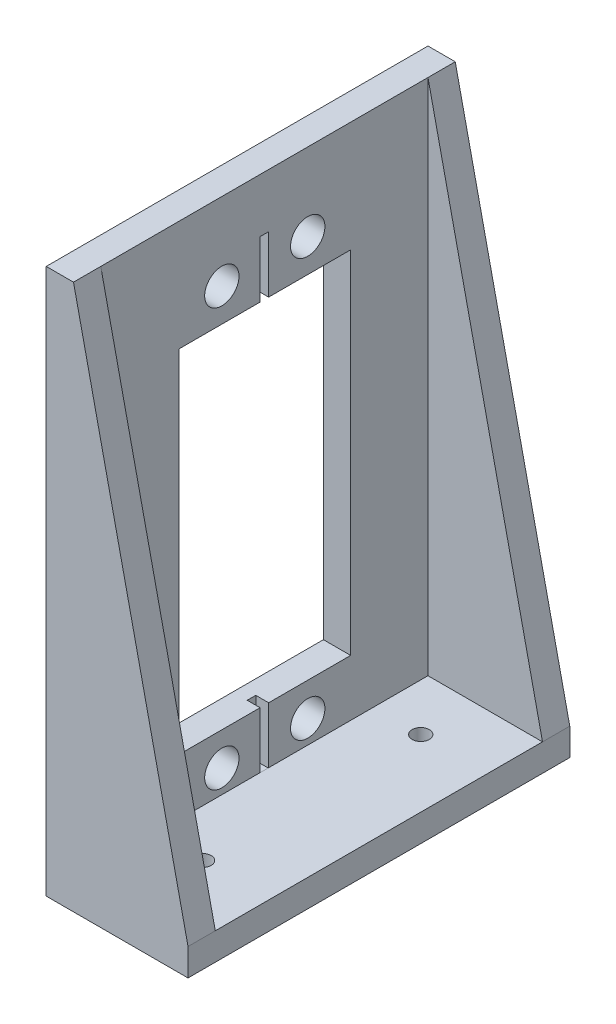
ISO-10303-21;
HEADER;
FILE_DESCRIPTION(('STEP AP214'),'2;1');
FILE_NAME('part.step','',(''),(''),'','','');
FILE_SCHEMA(('AUTOMOTIVE_DESIGN { 1 0 10303 214 1 1 1 1 }'));
ENDSEC;
DATA;
#1=APPLICATION_CONTEXT('core data for automotive mechanical design processes');
#2=APPLICATION_PROTOCOL_DEFINITION('international standard','automotive_design',2000,#1);
#3=PRODUCT_CONTEXT('',#1,'mechanical');
#4=PRODUCT('Part','Part','',(#3));
#5=PRODUCT_RELATED_PRODUCT_CATEGORY('part','',(#4));
#6=PRODUCT_DEFINITION_FORMATION('','',#4);
#7=PRODUCT_DEFINITION_CONTEXT('part definition',#1,'design');
#8=PRODUCT_DEFINITION('design','',#6,#7);
#9=PRODUCT_DEFINITION_SHAPE('','',#8);
#10=(LENGTH_UNIT() NAMED_UNIT(*) SI_UNIT(.MILLI.,.METRE.));
#11=(NAMED_UNIT(*) PLANE_ANGLE_UNIT() SI_UNIT($,.RADIAN.));
#12=(NAMED_UNIT(*) SI_UNIT($,.STERADIAN.) SOLID_ANGLE_UNIT());
#13=UNCERTAINTY_MEASURE_WITH_UNIT(LENGTH_MEASURE(1.E-05),#10,'distance_accuracy_value','');
#14=(GEOMETRIC_REPRESENTATION_CONTEXT(3) GLOBAL_UNCERTAINTY_ASSIGNED_CONTEXT((#13)) GLOBAL_UNIT_ASSIGNED_CONTEXT((#10,
#11,#12)) REPRESENTATION_CONTEXT('',''));
#15=CARTESIAN_POINT('',(0.,0.,0.));
#16=DIRECTION('',(0.,0.,1.));
#17=DIRECTION('',(1.,0.,0.));
#18=AXIS2_PLACEMENT_3D('',#15,#16,#17);
#19=CARTESIAN_POINT('',(3.175,3.175,22.225));
#20=DIRECTION('',(0.,-1.,0.));
#21=DIRECTION('',(1.,0.,0.));
#22=AXIS2_PLACEMENT_3D('',#19,#20,#21);
#23=PLANE('',#22);
#24=CARTESIAN_POINT('',(8.67999991199999,3.175,-12.7));
#25=DIRECTION('',(0.,1.,0.));
#26=DIRECTION('',(-1.,0.,0.));
#27=AXIS2_PLACEMENT_3D('',#24,#25,#26);
#28=CIRCLE('',#27,1.000000032);
#29=CARTESIAN_POINT('',(7.67999987999999,3.175,-12.7));
#30=VERTEX_POINT('',#29);
#31=EDGE_CURVE('E367',#30,#30,#28,.T.);
#32=ORIENTED_EDGE('',*,*,#31,.F.);
#33=EDGE_LOOP('',(#32));
#34=FACE_BOUND('',#33,.T.);
#35=CARTESIAN_POINT('',(8.67999991199999,3.175,12.7));
#36=DIRECTION('',(0.,1.,0.));
#37=DIRECTION('',(1.,0.,0.));
#38=AXIS2_PLACEMENT_3D('',#35,#36,#37);
#39=CIRCLE('',#38,1.000000032);
#40=CARTESIAN_POINT('',(9.679999944,3.175,12.7));
#41=VERTEX_POINT('',#40);
#42=EDGE_CURVE('E371',#41,#41,#39,.T.);
#43=ORIENTED_EDGE('',*,*,#42,.F.);
#44=EDGE_LOOP('',(#43));
#45=FACE_BOUND('',#44,.T.);
#46=DIRECTION('',(1.,0.,0.));
#47=VECTOR('',#46,1.);
#48=CARTESIAN_POINT('',(16.51,3.175,-19.05));
#49=LINE('',#48,#47);
#50=CARTESIAN_POINT('',(3.175,3.175,-19.05));
#51=VERTEX_POINT('',#50);
#52=CARTESIAN_POINT('',(16.51,3.175,-19.05));
#53=VERTEX_POINT('',#52);
#54=EDGE_CURVE('E386',#51,#53,#49,.T.);
#55=ORIENTED_EDGE('',*,*,#54,.F.);
#56=DIRECTION('',(0.,0.,-1.));
#57=VECTOR('',#56,1.);
#58=CARTESIAN_POINT('',(3.175,3.175,22.225));
#59=LINE('',#58,#57);
#60=CARTESIAN_POINT('',(3.175,3.175,-0.500000016));
#61=VERTEX_POINT('',#60);
#62=EDGE_CURVE('E456',#61,#51,#59,.T.);
#63=ORIENTED_EDGE('',*,*,#62,.F.);
#64=DIRECTION('',(0.,0.,1.));
#65=VECTOR('',#64,1.);
#66=CARTESIAN_POINT('',(3.175,3.175,22.225));
#67=LINE('',#66,#65);
#68=CARTESIAN_POINT('',(3.175,3.175,0.500000016));
#69=VERTEX_POINT('',#68);
#70=EDGE_CURVE('E235',#61,#69,#67,.T.);
#71=ORIENTED_EDGE('',*,*,#70,.T.);
#72=CARTESIAN_POINT('',(3.175,3.175,19.05));
#73=VERTEX_POINT('',#72);
#74=EDGE_CURVE('E457',#73,#69,#59,.T.);
#75=ORIENTED_EDGE('',*,*,#74,.F.);
#76=DIRECTION('',(1.,0.,0.));
#77=VECTOR('',#76,1.);
#78=CARTESIAN_POINT('',(16.51,3.175,19.05));
#79=LINE('',#78,#77);
#80=CARTESIAN_POINT('',(16.51,3.175,19.05));
#81=VERTEX_POINT('',#80);
#82=EDGE_CURVE('E405',#73,#81,#79,.T.);
#83=ORIENTED_EDGE('',*,*,#82,.T.);
#84=DIRECTION('',(0.,0.,-1.));
#85=VECTOR('',#84,1.);
#86=CARTESIAN_POINT('',(16.51,3.175,22.225));
#87=LINE('',#86,#85);
#88=EDGE_CURVE('E460',#81,#53,#87,.T.);
#89=ORIENTED_EDGE('',*,*,#88,.T.);
#90=EDGE_LOOP('',(#55,#63,#71,#75,#83,#89));
#91=FACE_BOUND('',#90,.T.);
#92=ADVANCED_FACE('F43',(#34,#45,#91),#23,.F.);
#93=CARTESIAN_POINT('',(3.175,63.5,22.225));
#94=DIRECTION('',(-1.,0.,0.));
#95=DIRECTION('',(0.,-1.,0.));
#96=AXIS2_PLACEMENT_3D('',#93,#94,#95);
#97=PLANE('',#96);
#98=ORIENTED_EDGE('',*,*,#74,.T.);
#99=DIRECTION('',(0.,1.,0.));
#100=VECTOR('',#99,1.);
#101=CARTESIAN_POINT('',(3.175,3.120999981,0.500000016));
#102=LINE('',#101,#100);
#103=CARTESIAN_POINT('',(3.175,9.724999981,0.500000016));
#104=VERTEX_POINT('',#103);
#105=EDGE_CURVE('E197',#69,#104,#102,.T.);
#106=ORIENTED_EDGE('',*,*,#105,.T.);
#107=DIRECTION('',(0.,0.,-1.));
#108=VECTOR('',#107,1.);
#109=CARTESIAN_POINT('',(3.175,9.724999981,9.95299990599999));
#110=LINE('',#109,#108);
#111=CARTESIAN_POINT('',(3.175,9.724999981,9.95299990599999));
#112=VERTEX_POINT('',#111);
#113=EDGE_CURVE('E303',#112,#104,#110,.T.);
#114=ORIENTED_EDGE('',*,*,#113,.F.);
#115=DIRECTION('',(0.,-1.,0.));
#116=VECTOR('',#115,1.);
#117=CARTESIAN_POINT('',(3.175,50.624999969,9.952999906));
#118=LINE('',#117,#116);
#119=CARTESIAN_POINT('',(3.175,50.624999969,9.952999906));
#120=VERTEX_POINT('',#119);
#121=EDGE_CURVE('E273',#120,#112,#118,.T.);
#122=ORIENTED_EDGE('',*,*,#121,.F.);
#123=DIRECTION('',(0.,0.,1.));
#124=VECTOR('',#123,1.);
#125=CARTESIAN_POINT('',(3.175,50.624999969,9.952999906));
#126=LINE('',#125,#124);
#127=CARTESIAN_POINT('',(3.175,50.624999969,0.500000016));
#128=VERTEX_POINT('',#127);
#129=EDGE_CURVE('E311',#128,#120,#126,.T.);
#130=ORIENTED_EDGE('',*,*,#129,.F.);
#131=DIRECTION('',(0.,-1.,0.));
#132=VECTOR('',#131,1.);
#133=CARTESIAN_POINT('',(3.175,57.228999969,0.500000016));
#134=LINE('',#133,#132);
#135=CARTESIAN_POINT('',(3.175,57.228999969,0.500000016));
#136=VERTEX_POINT('',#135);
#137=EDGE_CURVE('E67',#136,#128,#134,.T.);
#138=ORIENTED_EDGE('',*,*,#137,.F.);
#139=DIRECTION('',(0.,0.,1.));
#140=VECTOR('',#139,1.);
#141=CARTESIAN_POINT('',(3.175,57.228999969,-0.500000016));
#142=LINE('',#141,#140);
#143=CARTESIAN_POINT('',(3.175,57.228999969,-0.500000016));
#144=VERTEX_POINT('',#143);
#145=EDGE_CURVE('E244',#144,#136,#142,.T.);
#146=ORIENTED_EDGE('',*,*,#145,.F.);
#147=DIRECTION('',(0.,-1.,0.));
#148=VECTOR('',#147,1.);
#149=CARTESIAN_POINT('',(3.175,57.228999969,-0.500000016));
#150=LINE('',#149,#148);
#151=CARTESIAN_POINT('',(3.175,50.624999969,-0.500000016));
#152=VERTEX_POINT('',#151);
#153=EDGE_CURVE('E269',#144,#152,#150,.T.);
#154=ORIENTED_EDGE('',*,*,#153,.T.);
#155=CARTESIAN_POINT('',(3.175,50.624999969,-10.046999972));
#156=VERTEX_POINT('',#155);
#157=EDGE_CURVE('E287',#156,#152,#126,.T.);
#158=ORIENTED_EDGE('',*,*,#157,.F.);
#159=DIRECTION('',(0.,1.,0.));
#160=VECTOR('',#159,1.);
#161=CARTESIAN_POINT('',(3.175,50.624999969,-10.046999972));
#162=LINE('',#161,#160);
#163=CARTESIAN_POINT('',(3.175,9.724999981,-10.046999972));
#164=VERTEX_POINT('',#163);
#165=EDGE_CURVE('E307',#164,#156,#162,.T.);
#166=ORIENTED_EDGE('',*,*,#165,.F.);
#167=CARTESIAN_POINT('',(3.175,9.724999981,-0.500000015999997));
#168=VERTEX_POINT('',#167);
#169=EDGE_CURVE('E302',#168,#164,#110,.T.);
#170=ORIENTED_EDGE('',*,*,#169,.F.);
#171=DIRECTION('',(0.,1.,0.));
#172=VECTOR('',#171,1.);
#173=CARTESIAN_POINT('',(3.175,3.120999981,-0.500000016));
#174=LINE('',#173,#172);
#175=EDGE_CURVE('E59',#61,#168,#174,.T.);
#176=ORIENTED_EDGE('',*,*,#175,.F.);
#177=ORIENTED_EDGE('',*,*,#62,.T.);
#178=DIRECTION('',(0.,-1.,0.));
#179=VECTOR('',#178,1.);
#180=CARTESIAN_POINT('',(3.175,3.175,-19.05));
#181=LINE('',#180,#179);
#182=CARTESIAN_POINT('',(3.175,63.5,-19.05));
#183=VERTEX_POINT('',#182);
#184=EDGE_CURVE('E378',#183,#51,#181,.T.);
#185=ORIENTED_EDGE('',*,*,#184,.F.);
#186=DIRECTION('',(0.,0.,-1.));
#187=VECTOR('',#186,1.);
#188=CARTESIAN_POINT('',(3.175,63.5,22.225));
#189=LINE('',#188,#187);
#190=CARTESIAN_POINT('',(3.175,63.5,19.05));
#191=VERTEX_POINT('',#190);
#192=EDGE_CURVE('E451',#191,#183,#189,.T.);
#193=ORIENTED_EDGE('',*,*,#192,.F.);
#194=DIRECTION('',(0.,-1.,0.));
#195=VECTOR('',#194,1.);
#196=CARTESIAN_POINT('',(3.175,3.175,19.05));
#197=LINE('',#196,#195);
#198=EDGE_CURVE('E401',#191,#73,#197,.T.);
#199=ORIENTED_EDGE('',*,*,#198,.T.);
#200=EDGE_LOOP('',(#98,#106,#114,#122,#130,#138,#146,#154,#158,#166,#170,#176,#177,#185,#193,#199));
#201=FACE_BOUND('',#200,.T.);
#202=CARTESIAN_POINT('',(3.175,5.874999934,-5.047000066));
#203=DIRECTION('',(1.,0.,0.));
#204=DIRECTION('',(0.,1.,0.));
#205=AXIS2_PLACEMENT_3D('',#202,#203,#204);
#206=CIRCLE('',#205,2.000000064);
#207=CARTESIAN_POINT('',(3.175,7.874999998,-5.047000066));
#208=VERTEX_POINT('',#207);
#209=EDGE_CURVE('E338',#208,#208,#206,.T.);
#210=ORIENTED_EDGE('',*,*,#209,.F.);
#211=EDGE_LOOP('',(#210));
#212=FACE_BOUND('',#211,.T.);
#213=CARTESIAN_POINT('',(3.175,54.475000016,4.953));
#214=DIRECTION('',(1.,0.,0.));
#215=DIRECTION('',(0.,1.,0.));
#216=AXIS2_PLACEMENT_3D('',#213,#214,#215);
#217=CIRCLE('',#216,2.000000064);
#218=CARTESIAN_POINT('',(3.175,56.47500008,4.953));
#219=VERTEX_POINT('',#218);
#220=EDGE_CURVE('E347',#219,#219,#217,.T.);
#221=ORIENTED_EDGE('',*,*,#220,.F.);
#222=EDGE_LOOP('',(#221));
#223=FACE_BOUND('',#222,.T.);
#224=CARTESIAN_POINT('',(3.175,54.475000016,-5.047000066));
#225=DIRECTION('',(1.,0.,0.));
#226=DIRECTION('',(0.,1.,0.));
#227=AXIS2_PLACEMENT_3D('',#224,#225,#226);
#228=CIRCLE('',#227,2.000000064);
#229=CARTESIAN_POINT('',(3.175,56.47500008,-5.047000066));
#230=VERTEX_POINT('',#229);
#231=EDGE_CURVE('E330',#230,#230,#228,.T.);
#232=ORIENTED_EDGE('',*,*,#231,.F.);
#233=EDGE_LOOP('',(#232));
#234=FACE_BOUND('',#233,.T.);
#235=CARTESIAN_POINT('',(3.175,5.874999934,4.953));
#236=DIRECTION('',(1.,0.,0.));
#237=DIRECTION('',(0.,1.,0.));
#238=AXIS2_PLACEMENT_3D('',#235,#236,#237);
#239=CIRCLE('',#238,2.000000064);
#240=CARTESIAN_POINT('',(3.175,7.874999998,4.953));
#241=VERTEX_POINT('',#240);
#242=EDGE_CURVE('E342',#241,#241,#239,.T.);
#243=ORIENTED_EDGE('',*,*,#242,.F.);
#244=EDGE_LOOP('',(#243));
#245=FACE_BOUND('',#244,.T.);
#246=ADVANCED_FACE('F503',(#201,#212,#223,#234,#245),#97,.F.);
#247=CARTESIAN_POINT('',(16.51,0.,22.225));
#248=DIRECTION('',(0.,1.,0.));
#249=DIRECTION('',(-1.,0.,0.));
#250=AXIS2_PLACEMENT_3D('',#247,#248,#249);
#251=PLANE('',#250);
#252=CARTESIAN_POINT('',(8.67999991199999,0.,-12.7));
#253=DIRECTION('',(0.,1.,0.));
#254=DIRECTION('',(-1.,0.,0.));
#255=AXIS2_PLACEMENT_3D('',#252,#253,#254);
#256=CIRCLE('',#255,1.000000032);
#257=CARTESIAN_POINT('',(7.67999987999999,0.,-12.7));
#258=VERTEX_POINT('',#257);
#259=EDGE_CURVE('E362',#258,#258,#256,.T.);
#260=ORIENTED_EDGE('',*,*,#259,.T.);
#261=EDGE_LOOP('',(#260));
#262=FACE_BOUND('',#261,.T.);
#263=CARTESIAN_POINT('',(8.67999991199999,0.,12.7));
#264=DIRECTION('',(0.,1.,0.));
#265=DIRECTION('',(1.,0.,0.));
#266=AXIS2_PLACEMENT_3D('',#263,#264,#265);
#267=CIRCLE('',#266,1.000000032);
#268=CARTESIAN_POINT('',(9.679999944,0.,12.7));
#269=VERTEX_POINT('',#268);
#270=EDGE_CURVE('E358',#269,#269,#267,.T.);
#271=ORIENTED_EDGE('',*,*,#270,.T.);
#272=EDGE_LOOP('',(#271));
#273=FACE_BOUND('',#272,.T.);
#274=DIRECTION('',(1.,0.,0.));
#275=VECTOR('',#274,1.);
#276=CARTESIAN_POINT('',(16.51,0.,-22.225));
#277=LINE('',#276,#275);
#278=CARTESIAN_POINT('',(0.,0.,-22.225));
#279=VERTEX_POINT('',#278);
#280=CARTESIAN_POINT('',(16.51,0.,-22.225));
#281=VERTEX_POINT('',#280);
#282=EDGE_CURVE('E413',#279,#281,#277,.T.);
#283=ORIENTED_EDGE('',*,*,#282,.T.);
#284=DIRECTION('',(0.,0.,-1.));
#285=VECTOR('',#284,1.);
#286=CARTESIAN_POINT('',(16.51,0.,22.225));
#287=LINE('',#286,#285);
#288=CARTESIAN_POINT('',(16.51,0.,22.225));
#289=VERTEX_POINT('',#288);
#290=EDGE_CURVE('E11',#289,#281,#287,.T.);
#291=ORIENTED_EDGE('',*,*,#290,.F.);
#292=DIRECTION('',(1.,0.,0.));
#293=VECTOR('',#292,1.);
#294=CARTESIAN_POINT('',(16.51,0.,22.225));
#295=LINE('',#294,#293);
#296=CARTESIAN_POINT('',(0.,0.,22.225));
#297=VERTEX_POINT('',#296);
#298=EDGE_CURVE('E417',#297,#289,#295,.T.);
#299=ORIENTED_EDGE('',*,*,#298,.F.);
#300=DIRECTION('',(0.,0.,-1.));
#301=VECTOR('',#300,1.);
#302=CARTESIAN_POINT('',(0.,0.,22.225));
#303=LINE('',#302,#301);
#304=EDGE_CURVE('E432',#297,#279,#303,.T.);
#305=ORIENTED_EDGE('',*,*,#304,.T.);
#306=EDGE_LOOP('',(#283,#291,#299,#305));
#307=FACE_BOUND('',#306,.T.);
#308=ADVANCED_FACE('F45',(#262,#273,#307),#251,.F.);
#309=CARTESIAN_POINT('',(16.51,3.175,22.225));
#310=DIRECTION('',(-1.,0.,0.));
#311=DIRECTION('',(0.,0.,1.));
#312=AXIS2_PLACEMENT_3D('',#309,#310,#311);
#313=PLANE('',#312);
#314=DIRECTION('',(0.,1.,0.));
#315=VECTOR('',#314,1.);
#316=CARTESIAN_POINT('',(16.51,3.175,-22.225));
#317=LINE('',#316,#315);
#318=CARTESIAN_POINT('',(16.51,3.175,-22.225));
#319=VERTEX_POINT('',#318);
#320=EDGE_CURVE('E436',#281,#319,#317,.T.);
#321=ORIENTED_EDGE('',*,*,#320,.T.);
#322=DIRECTION('',(0.,0.,-1.));
#323=VECTOR('',#322,1.);
#324=CARTESIAN_POINT('',(16.51,3.175,-19.05));
#325=LINE('',#324,#323);
#326=EDGE_CURVE('E394',#53,#319,#325,.T.);
#327=ORIENTED_EDGE('',*,*,#326,.F.);
#328=ORIENTED_EDGE('',*,*,#88,.F.);
#329=CARTESIAN_POINT('',(16.51,3.175,22.225));
#330=VERTEX_POINT('',#329);
#331=EDGE_CURVE('E52',#330,#81,#87,.T.);
#332=ORIENTED_EDGE('',*,*,#331,.F.);
#333=DIRECTION('',(0.,1.,0.));
#334=VECTOR('',#333,1.);
#335=CARTESIAN_POINT('',(16.51,3.175,22.225));
#336=LINE('',#335,#334);
#337=EDGE_CURVE('E421',#289,#330,#336,.T.);
#338=ORIENTED_EDGE('',*,*,#337,.F.);
#339=ORIENTED_EDGE('',*,*,#290,.T.);
#340=EDGE_LOOP('',(#321,#327,#328,#332,#338,#339));
#341=FACE_BOUND('',#340,.T.);
#342=ADVANCED_FACE('F564',(#341),#313,.F.);
#343=CARTESIAN_POINT('',(0.,63.5,22.225));
#344=DIRECTION('',(0.,-1.,0.));
#345=DIRECTION('',(0.,0.,-1.));
#346=AXIS2_PLACEMENT_3D('',#343,#344,#345);
#347=PLANE('',#346);
#348=DIRECTION('',(-1.,0.,0.));
#349=VECTOR('',#348,1.);
#350=CARTESIAN_POINT('',(0.,63.5,-22.225));
#351=LINE('',#350,#349);
#352=CARTESIAN_POINT('',(3.175,63.5,-22.225));
#353=VERTEX_POINT('',#352);
#354=CARTESIAN_POINT('',(0.,63.5,-22.225));
#355=VERTEX_POINT('',#354);
#356=EDGE_CURVE('E439',#353,#355,#351,.T.);
#357=ORIENTED_EDGE('',*,*,#356,.T.);
#358=DIRECTION('',(0.,0.,-1.));
#359=VECTOR('',#358,1.);
#360=CARTESIAN_POINT('',(0.,63.5,22.225));
#361=LINE('',#360,#359);
#362=CARTESIAN_POINT('',(0.,63.5,22.225));
#363=VERTEX_POINT('',#362);
#364=EDGE_CURVE('E447',#363,#355,#361,.T.);
#365=ORIENTED_EDGE('',*,*,#364,.F.);
#366=DIRECTION('',(-1.,0.,0.));
#367=VECTOR('',#366,1.);
#368=CARTESIAN_POINT('',(0.,63.5,22.225));
#369=LINE('',#368,#367);
#370=CARTESIAN_POINT('',(3.175,63.5,22.225));
#371=VERTEX_POINT('',#370);
#372=EDGE_CURVE('E426',#371,#363,#369,.T.);
#373=ORIENTED_EDGE('',*,*,#372,.F.);
#374=EDGE_CURVE('E452',#371,#191,#189,.T.);
#375=ORIENTED_EDGE('',*,*,#374,.T.);
#376=ORIENTED_EDGE('',*,*,#192,.T.);
#377=DIRECTION('',(0.,0.,-1.));
#378=VECTOR('',#377,1.);
#379=CARTESIAN_POINT('',(3.175,63.5,-19.05));
#380=LINE('',#379,#378);
#381=EDGE_CURVE('E390',#183,#353,#380,.T.);
#382=ORIENTED_EDGE('',*,*,#381,.T.);
#383=EDGE_LOOP('',(#357,#365,#373,#375,#376,#382));
#384=FACE_BOUND('',#383,.T.);
#385=ADVANCED_FACE('F483',(#384),#347,.F.);
#386=CARTESIAN_POINT('',(0.,0.,22.225));
#387=DIRECTION('',(1.,0.,0.));
#388=DIRECTION('',(0.,0.,-1.));
#389=AXIS2_PLACEMENT_3D('',#386,#387,#388);
#390=PLANE('',#389);
#391=DIRECTION('',(0.,0.,1.));
#392=VECTOR('',#391,1.);
#393=CARTESIAN_POINT('',(0.,50.624999969,9.952999906));
#394=LINE('',#393,#392);
#395=CARTESIAN_POINT('',(0.,50.624999969,-10.046999972));
#396=VERTEX_POINT('',#395);
#397=CARTESIAN_POINT('',(0.,50.624999969,9.952999906));
#398=VERTEX_POINT('',#397);
#399=EDGE_CURVE('E295',#396,#398,#394,.T.);
#400=ORIENTED_EDGE('',*,*,#399,.T.);
#401=DIRECTION('',(0.,-1.,0.));
#402=VECTOR('',#401,1.);
#403=CARTESIAN_POINT('',(0.,50.624999969,9.952999906));
#404=LINE('',#403,#402);
#405=CARTESIAN_POINT('',(0.,9.724999981,9.95299990599999));
#406=VERTEX_POINT('',#405);
#407=EDGE_CURVE('E282',#398,#406,#404,.T.);
#408=ORIENTED_EDGE('',*,*,#407,.T.);
#409=DIRECTION('',(0.,0.,-1.));
#410=VECTOR('',#409,1.);
#411=CARTESIAN_POINT('',(0.,9.724999981,9.95299990599999));
#412=LINE('',#411,#410);
#413=CARTESIAN_POINT('',(0.,9.724999981,-10.046999972));
#414=VERTEX_POINT('',#413);
#415=EDGE_CURVE('E286',#406,#414,#412,.T.);
#416=ORIENTED_EDGE('',*,*,#415,.T.);
#417=DIRECTION('',(0.,1.,0.));
#418=VECTOR('',#417,1.);
#419=CARTESIAN_POINT('',(0.,50.624999969,-10.046999972));
#420=LINE('',#419,#418);
#421=EDGE_CURVE('E291',#414,#396,#420,.T.);
#422=ORIENTED_EDGE('',*,*,#421,.T.);
#423=EDGE_LOOP('',(#400,#408,#416,#422));
#424=FACE_BOUND('',#423,.T.);
#425=CARTESIAN_POINT('',(0.,5.874999934,-5.047000066));
#426=DIRECTION('',(1.,0.,0.));
#427=DIRECTION('',(0.,1.,0.));
#428=AXIS2_PLACEMENT_3D('',#425,#426,#427);
#429=CIRCLE('',#428,2.000000064);
#430=CARTESIAN_POINT('',(0.,7.874999998,-5.047000066));
#431=VERTEX_POINT('',#430);
#432=EDGE_CURVE('E343',#431,#431,#429,.T.);
#433=ORIENTED_EDGE('',*,*,#432,.T.);
#434=EDGE_LOOP('',(#433));
#435=FACE_BOUND('',#434,.T.);
#436=CARTESIAN_POINT('',(0.,54.475000016,4.953));
#437=DIRECTION('',(1.,0.,0.));
#438=DIRECTION('',(0.,1.,0.));
#439=AXIS2_PLACEMENT_3D('',#436,#437,#438);
#440=CIRCLE('',#439,2.000000064);
#441=CARTESIAN_POINT('',(0.,56.47500008,4.953));
#442=VERTEX_POINT('',#441);
#443=EDGE_CURVE('E334',#442,#442,#440,.T.);
#444=ORIENTED_EDGE('',*,*,#443,.T.);
#445=EDGE_LOOP('',(#444));
#446=FACE_BOUND('',#445,.T.);
#447=CARTESIAN_POINT('',(0.,54.475000016,-5.047000066));
#448=DIRECTION('',(1.,0.,0.));
#449=DIRECTION('',(0.,1.,0.));
#450=AXIS2_PLACEMENT_3D('',#447,#448,#449);
#451=CIRCLE('',#450,2.000000064);
#452=CARTESIAN_POINT('',(0.,56.47500008,-5.047000066));
#453=VERTEX_POINT('',#452);
#454=EDGE_CURVE('E319',#453,#453,#451,.T.);
#455=ORIENTED_EDGE('',*,*,#454,.T.);
#456=EDGE_LOOP('',(#455));
#457=FACE_BOUND('',#456,.T.);
#458=CARTESIAN_POINT('',(0.,5.874999934,4.953));
#459=DIRECTION('',(1.,0.,0.));
#460=DIRECTION('',(0.,1.,0.));
#461=AXIS2_PLACEMENT_3D('',#458,#459,#460);
#462=CIRCLE('',#461,2.000000064);
#463=CARTESIAN_POINT('',(0.,7.874999998,4.953));
#464=VERTEX_POINT('',#463);
#465=EDGE_CURVE('E354',#464,#464,#462,.T.);
#466=ORIENTED_EDGE('',*,*,#465,.T.);
#467=EDGE_LOOP('',(#466));
#468=FACE_BOUND('',#467,.T.);
#469=DIRECTION('',(0.,-1.,0.));
#470=VECTOR('',#469,1.);
#471=CARTESIAN_POINT('',(0.,0.,-22.225));
#472=LINE('',#471,#470);
#473=EDGE_CURVE('E422',#355,#279,#472,.T.);
#474=ORIENTED_EDGE('',*,*,#473,.T.);
#475=ORIENTED_EDGE('',*,*,#304,.F.);
#476=DIRECTION('',(0.,-1.,0.));
#477=VECTOR('',#476,1.);
#478=CARTESIAN_POINT('',(0.,0.,22.225));
#479=LINE('',#478,#477);
#480=EDGE_CURVE('E429',#363,#297,#479,.T.);
#481=ORIENTED_EDGE('',*,*,#480,.F.);
#482=ORIENTED_EDGE('',*,*,#364,.T.);
#483=EDGE_LOOP('',(#474,#475,#481,#482));
#484=FACE_BOUND('',#483,.T.);
#485=ADVANCED_FACE('F492',(#424,#435,#446,#457,#468,#484),#390,.F.);
#486=CARTESIAN_POINT('',(0.,0.,22.225));
#487=DIRECTION('',(0.,0.,-1.));
#488=DIRECTION('',(-1.,0.,0.));
#489=AXIS2_PLACEMENT_3D('',#486,#487,#488);
#490=PLANE('',#489);
#491=DIRECTION('',(-0.215842043801446,0.976428293387494,0.));
#492=VECTOR('',#491,1.);
#493=CARTESIAN_POINT('',(3.175,63.5,22.225));
#494=LINE('',#493,#492);
#495=EDGE_CURVE('E398',#330,#371,#494,.T.);
#496=ORIENTED_EDGE('',*,*,#495,.T.);
#497=ORIENTED_EDGE('',*,*,#372,.T.);
#498=ORIENTED_EDGE('',*,*,#480,.T.);
#499=ORIENTED_EDGE('',*,*,#298,.T.);
#500=ORIENTED_EDGE('',*,*,#337,.T.);
#501=EDGE_LOOP('',(#496,#497,#498,#499,#500));
#502=FACE_BOUND('',#501,.T.);
#503=ADVANCED_FACE('F498',(#502),#490,.F.);
#504=CARTESIAN_POINT('',(0.,0.,-22.225));
#505=DIRECTION('',(0.,0.,-1.));
#506=DIRECTION('',(-1.,0.,0.));
#507=AXIS2_PLACEMENT_3D('',#504,#505,#506);
#508=PLANE('',#507);
#509=ORIENTED_EDGE('',*,*,#356,.F.);
#510=DIRECTION('',(-0.215842043801446,0.976428293387494,0.));
#511=VECTOR('',#510,1.);
#512=CARTESIAN_POINT('',(3.175,63.5,-22.225));
#513=LINE('',#512,#511);
#514=EDGE_CURVE('E366',#319,#353,#513,.T.);
#515=ORIENTED_EDGE('',*,*,#514,.F.);
#516=ORIENTED_EDGE('',*,*,#320,.F.);
#517=ORIENTED_EDGE('',*,*,#282,.F.);
#518=ORIENTED_EDGE('',*,*,#473,.F.);
#519=EDGE_LOOP('',(#509,#515,#516,#517,#518));
#520=FACE_BOUND('',#519,.T.);
#521=ADVANCED_FACE('F488',(#520),#508,.T.);
#522=CARTESIAN_POINT('',(3.175,63.5,19.05));
#523=DIRECTION('',(0.976428293387494,0.215842043801446,0.));
#524=DIRECTION('',(-0.215842043801446,0.976428293387494,0.));
#525=AXIS2_PLACEMENT_3D('',#522,#523,#524);
#526=PLANE('',#525);
#527=ORIENTED_EDGE('',*,*,#495,.F.);
#528=ORIENTED_EDGE('',*,*,#331,.T.);
#529=DIRECTION('',(-0.215842043801446,0.976428293387494,0.));
#530=VECTOR('',#529,1.);
#531=CARTESIAN_POINT('',(3.175,63.5,19.05));
#532=LINE('',#531,#530);
#533=EDGE_CURVE('E409',#81,#191,#532,.T.);
#534=ORIENTED_EDGE('',*,*,#533,.T.);
#535=ORIENTED_EDGE('',*,*,#374,.F.);
#536=EDGE_LOOP('',(#527,#528,#534,#535));
#537=FACE_BOUND('',#536,.T.);
#538=ADVANCED_FACE('F500',(#537),#526,.T.);
#539=CARTESIAN_POINT('',(0.,0.,19.05));
#540=DIRECTION('',(0.,0.,1.));
#541=DIRECTION('',(1.,0.,0.));
#542=AXIS2_PLACEMENT_3D('',#539,#540,#541);
#543=PLANE('',#542);
#544=ORIENTED_EDGE('',*,*,#198,.F.);
#545=ORIENTED_EDGE('',*,*,#533,.F.);
#546=ORIENTED_EDGE('',*,*,#82,.F.);
#547=EDGE_LOOP('',(#544,#545,#546));
#548=FACE_BOUND('',#547,.T.);
#549=ADVANCED_FACE('F595',(#548),#543,.F.);
#550=CARTESIAN_POINT('',(3.175,63.5,-19.05));
#551=DIRECTION('',(-0.976428293387494,-0.215842043801446,0.));
#552=DIRECTION('',(0.215842043801446,-0.976428293387494,0.));
#553=AXIS2_PLACEMENT_3D('',#550,#551,#552);
#554=PLANE('',#553);
#555=ORIENTED_EDGE('',*,*,#514,.T.);
#556=ORIENTED_EDGE('',*,*,#381,.F.);
#557=DIRECTION('',(-0.215842043801446,0.976428293387494,0.));
#558=VECTOR('',#557,1.);
#559=CARTESIAN_POINT('',(3.175,63.5,-19.05));
#560=LINE('',#559,#558);
#561=EDGE_CURVE('E382',#53,#183,#560,.T.);
#562=ORIENTED_EDGE('',*,*,#561,.F.);
#563=ORIENTED_EDGE('',*,*,#326,.T.);
#564=EDGE_LOOP('',(#555,#556,#562,#563));
#565=FACE_BOUND('',#564,.T.);
#566=ADVANCED_FACE('F478',(#565),#554,.F.);
#567=CARTESIAN_POINT('',(0.,0.,-19.05));
#568=DIRECTION('',(0.,0.,-1.));
#569=DIRECTION('',(1.,0.,0.));
#570=AXIS2_PLACEMENT_3D('',#567,#568,#569);
#571=PLANE('',#570);
#572=ORIENTED_EDGE('',*,*,#184,.T.);
#573=ORIENTED_EDGE('',*,*,#54,.T.);
#574=ORIENTED_EDGE('',*,*,#561,.T.);
#575=EDGE_LOOP('',(#572,#573,#574));
#576=FACE_BOUND('',#575,.T.);
#577=ADVANCED_FACE('F475',(#576),#571,.F.);
#578=CARTESIAN_POINT('',(8.67999991199999,0.,12.7));
#579=DIRECTION('',(0.,1.,0.));
#580=DIRECTION('',(-1.,0.,0.));
#581=AXIS2_PLACEMENT_3D('',#578,#579,#580);
#582=CYLINDRICAL_SURFACE('',#581,1.000000032);
#583=ORIENTED_EDGE('',*,*,#270,.F.);
#584=EDGE_LOOP('',(#583));
#585=FACE_BOUND('',#584,.T.);
#586=ORIENTED_EDGE('',*,*,#42,.T.);
#587=EDGE_LOOP('',(#586));
#588=FACE_BOUND('',#587,.T.);
#589=ADVANCED_FACE('F577',(#585,#588),#582,.F.);
#590=CARTESIAN_POINT('',(8.67999991199999,0.,-12.7));
#591=DIRECTION('',(0.,1.,0.));
#592=DIRECTION('',(-1.,0.,0.));
#593=AXIS2_PLACEMENT_3D('',#590,#591,#592);
#594=CYLINDRICAL_SURFACE('',#593,1.000000032);
#595=ORIENTED_EDGE('',*,*,#259,.F.);
#596=EDGE_LOOP('',(#595));
#597=FACE_BOUND('',#596,.T.);
#598=ORIENTED_EDGE('',*,*,#31,.T.);
#599=EDGE_LOOP('',(#598));
#600=FACE_BOUND('',#599,.T.);
#601=ADVANCED_FACE('F580',(#597,#600),#594,.F.);
#602=CARTESIAN_POINT('',(0.,5.874999934,4.953));
#603=DIRECTION('',(1.,0.,0.));
#604=DIRECTION('',(0.,1.,0.));
#605=AXIS2_PLACEMENT_3D('',#602,#603,#604);
#606=CYLINDRICAL_SURFACE('',#605,2.000000064);
#607=ORIENTED_EDGE('',*,*,#465,.F.);
#608=EDGE_LOOP('',(#607));
#609=FACE_BOUND('',#608,.T.);
#610=ORIENTED_EDGE('',*,*,#242,.T.);
#611=EDGE_LOOP('',(#610));
#612=FACE_BOUND('',#611,.T.);
#613=ADVANCED_FACE('F587',(#609,#612),#606,.F.);
#614=CARTESIAN_POINT('',(0.,54.475000016,-5.047000066));
#615=DIRECTION('',(1.,0.,0.));
#616=DIRECTION('',(0.,1.,0.));
#617=AXIS2_PLACEMENT_3D('',#614,#615,#616);
#618=CYLINDRICAL_SURFACE('',#617,2.000000064);
#619=ORIENTED_EDGE('',*,*,#454,.F.);
#620=EDGE_LOOP('',(#619));
#621=FACE_BOUND('',#620,.T.);
#622=ORIENTED_EDGE('',*,*,#231,.T.);
#623=EDGE_LOOP('',(#622));
#624=FACE_BOUND('',#623,.T.);
#625=ADVANCED_FACE('F619',(#621,#624),#618,.F.);
#626=CARTESIAN_POINT('',(0.,54.475000016,4.953));
#627=DIRECTION('',(1.,0.,0.));
#628=DIRECTION('',(0.,1.,0.));
#629=AXIS2_PLACEMENT_3D('',#626,#627,#628);
#630=CYLINDRICAL_SURFACE('',#629,2.000000064);
#631=ORIENTED_EDGE('',*,*,#443,.F.);
#632=EDGE_LOOP('',(#631));
#633=FACE_BOUND('',#632,.T.);
#634=ORIENTED_EDGE('',*,*,#220,.T.);
#635=EDGE_LOOP('',(#634));
#636=FACE_BOUND('',#635,.T.);
#637=ADVANCED_FACE('F625',(#633,#636),#630,.F.);
#638=CARTESIAN_POINT('',(0.,5.874999934,-5.047000066));
#639=DIRECTION('',(1.,0.,0.));
#640=DIRECTION('',(0.,1.,0.));
#641=AXIS2_PLACEMENT_3D('',#638,#639,#640);
#642=CYLINDRICAL_SURFACE('',#641,2.000000064);
#643=ORIENTED_EDGE('',*,*,#432,.F.);
#644=EDGE_LOOP('',(#643));
#645=FACE_BOUND('',#644,.T.);
#646=ORIENTED_EDGE('',*,*,#209,.T.);
#647=EDGE_LOOP('',(#646));
#648=FACE_BOUND('',#647,.T.);
#649=ADVANCED_FACE('F631',(#645,#648),#642,.F.);
#650=CARTESIAN_POINT('',(0.,50.624999969,9.952999906));
#651=DIRECTION('',(0.,0.,1.));
#652=DIRECTION('',(0.,-1.,0.));
#653=AXIS2_PLACEMENT_3D('',#650,#651,#652);
#654=PLANE('',#653);
#655=ORIENTED_EDGE('',*,*,#121,.T.);
#656=DIRECTION('',(1.,0.,0.));
#657=VECTOR('',#656,1.);
#658=CARTESIAN_POINT('',(0.,9.724999981,9.95299990599999));
#659=LINE('',#658,#657);
#660=EDGE_CURVE('E299',#406,#112,#659,.T.);
#661=ORIENTED_EDGE('',*,*,#660,.F.);
#662=ORIENTED_EDGE('',*,*,#407,.F.);
#663=DIRECTION('',(1.,0.,0.));
#664=VECTOR('',#663,1.);
#665=CARTESIAN_POINT('',(0.,50.624999969,9.952999906));
#666=LINE('',#665,#664);
#667=EDGE_CURVE('E315',#398,#120,#666,.T.);
#668=ORIENTED_EDGE('',*,*,#667,.T.);
#669=EDGE_LOOP('',(#655,#661,#662,#668));
#670=FACE_BOUND('',#669,.T.);
#671=ADVANCED_FACE('F521',(#670),#654,.F.);
#672=CARTESIAN_POINT('',(0.,50.624999969,9.952999906));
#673=DIRECTION('',(0.,1.,0.));
#674=DIRECTION('',(-1.,0.,0.));
#675=AXIS2_PLACEMENT_3D('',#672,#673,#674);
#676=PLANE('',#675);
#677=ORIENTED_EDGE('',*,*,#157,.T.);
#678=DIRECTION('',(1.,0.,0.));
#679=VECTOR('',#678,1.);
#680=CARTESIAN_POINT('',(1.674999952,50.624999969,-0.500000016));
#681=LINE('',#680,#679);
#682=CARTESIAN_POINT('',(1.674999952,50.624999969,-0.500000016));
#683=VERTEX_POINT('',#682);
#684=EDGE_CURVE('E249',#683,#152,#681,.T.);
#685=ORIENTED_EDGE('',*,*,#684,.F.);
#686=DIRECTION('',(0.,0.,-1.));
#687=VECTOR('',#686,1.);
#688=CARTESIAN_POINT('',(1.674999952,50.624999969,-0.500000016));
#689=LINE('',#688,#687);
#690=CARTESIAN_POINT('',(1.674999952,50.624999969,0.500000016));
#691=VERTEX_POINT('',#690);
#692=EDGE_CURVE('E263',#691,#683,#689,.T.);
#693=ORIENTED_EDGE('',*,*,#692,.F.);
#694=DIRECTION('',(-1.,0.,0.));
#695=VECTOR('',#694,1.);
#696=CARTESIAN_POINT('',(1.674999952,50.624999969,0.500000016));
#697=LINE('',#696,#695);
#698=EDGE_CURVE('E243',#128,#691,#697,.T.);
#699=ORIENTED_EDGE('',*,*,#698,.F.);
#700=ORIENTED_EDGE('',*,*,#129,.T.);
#701=ORIENTED_EDGE('',*,*,#667,.F.);
#702=ORIENTED_EDGE('',*,*,#399,.F.);
#703=DIRECTION('',(1.,0.,0.));
#704=VECTOR('',#703,1.);
#705=CARTESIAN_POINT('',(0.,50.624999969,-10.046999972));
#706=LINE('',#705,#704);
#707=EDGE_CURVE('E320',#396,#156,#706,.T.);
#708=ORIENTED_EDGE('',*,*,#707,.T.);
#709=EDGE_LOOP('',(#677,#685,#693,#699,#700,#701,#702,#708));
#710=FACE_BOUND('',#709,.T.);
#711=ADVANCED_FACE('F525',(#710),#676,.F.);
#712=CARTESIAN_POINT('',(0.,50.624999969,-10.046999972));
#713=DIRECTION('',(0.,0.,-1.));
#714=DIRECTION('',(0.,1.,0.));
#715=AXIS2_PLACEMENT_3D('',#712,#713,#714);
#716=PLANE('',#715);
#717=ORIENTED_EDGE('',*,*,#165,.T.);
#718=ORIENTED_EDGE('',*,*,#707,.F.);
#719=ORIENTED_EDGE('',*,*,#421,.F.);
#720=DIRECTION('',(1.,0.,0.));
#721=VECTOR('',#720,1.);
#722=CARTESIAN_POINT('',(0.,9.724999981,-10.046999972));
#723=LINE('',#722,#721);
#724=EDGE_CURVE('E323',#414,#164,#723,.T.);
#725=ORIENTED_EDGE('',*,*,#724,.T.);
#726=EDGE_LOOP('',(#717,#718,#719,#725));
#727=FACE_BOUND('',#726,.T.);
#728=ADVANCED_FACE('F540',(#727),#716,.F.);
#729=CARTESIAN_POINT('',(0.,9.724999981,9.95299990599999));
#730=DIRECTION('',(0.,-1.,0.));
#731=DIRECTION('',(1.,0.,0.));
#732=AXIS2_PLACEMENT_3D('',#729,#730,#731);
#733=PLANE('',#732);
#734=ORIENTED_EDGE('',*,*,#113,.T.);
#735=DIRECTION('',(1.,0.,0.));
#736=VECTOR('',#735,1.);
#737=CARTESIAN_POINT('',(0.,9.724999981,0.500000016));
#738=LINE('',#737,#736);
#739=CARTESIAN_POINT('',(1.674999952,9.724999981,0.500000016));
#740=VERTEX_POINT('',#739);
#741=EDGE_CURVE('E227',#740,#104,#738,.T.);
#742=ORIENTED_EDGE('',*,*,#741,.F.);
#743=DIRECTION('',(0.,0.,1.));
#744=VECTOR('',#743,1.);
#745=CARTESIAN_POINT('',(1.674999952,9.724999981,9.95299990599999));
#746=LINE('',#745,#744);
#747=CARTESIAN_POINT('',(1.674999952,9.724999981,-0.500000016));
#748=VERTEX_POINT('',#747);
#749=EDGE_CURVE('E216',#748,#740,#746,.T.);
#750=ORIENTED_EDGE('',*,*,#749,.F.);
#751=DIRECTION('',(-1.,0.,0.));
#752=VECTOR('',#751,1.);
#753=CARTESIAN_POINT('',(0.,9.724999981,-0.500000016));
#754=LINE('',#753,#752);
#755=EDGE_CURVE('E220',#168,#748,#754,.T.);
#756=ORIENTED_EDGE('',*,*,#755,.F.);
#757=ORIENTED_EDGE('',*,*,#169,.T.);
#758=ORIENTED_EDGE('',*,*,#724,.F.);
#759=ORIENTED_EDGE('',*,*,#415,.F.);
#760=ORIENTED_EDGE('',*,*,#660,.T.);
#761=EDGE_LOOP('',(#734,#742,#750,#756,#757,#758,#759,#760));
#762=FACE_BOUND('',#761,.T.);
#763=ADVANCED_FACE('F515',(#762),#733,.F.);
#764=CARTESIAN_POINT('',(1.674999952,57.228999969,-0.500000016));
#765=DIRECTION('',(0.,0.,-1.));
#766=DIRECTION('',(-1.,0.,0.));
#767=AXIS2_PLACEMENT_3D('',#764,#765,#766);
#768=PLANE('',#767);
#769=ORIENTED_EDGE('',*,*,#684,.T.);
#770=ORIENTED_EDGE('',*,*,#153,.F.);
#771=DIRECTION('',(1.,0.,0.));
#772=VECTOR('',#771,1.);
#773=CARTESIAN_POINT('',(1.674999952,57.228999969,-0.500000016));
#774=LINE('',#773,#772);
#775=CARTESIAN_POINT('',(1.674999952,57.228999969,-0.500000016));
#776=VERTEX_POINT('',#775);
#777=EDGE_CURVE('E257',#776,#144,#774,.T.);
#778=ORIENTED_EDGE('',*,*,#777,.F.);
#779=DIRECTION('',(0.,-1.,0.));
#780=VECTOR('',#779,1.);
#781=CARTESIAN_POINT('',(1.674999952,57.228999969,-0.500000016));
#782=LINE('',#781,#780);
#783=EDGE_CURVE('E274',#776,#683,#782,.T.);
#784=ORIENTED_EDGE('',*,*,#783,.T.);
#785=EDGE_LOOP('',(#769,#770,#778,#784));
#786=FACE_BOUND('',#785,.T.);
#787=ADVANCED_FACE('F640',(#786),#768,.F.);
#788=CARTESIAN_POINT('',(1.674999952,57.228999969,-0.500000016));
#789=DIRECTION('',(-1.,0.,0.));
#790=DIRECTION('',(0.,-1.,0.));
#791=AXIS2_PLACEMENT_3D('',#788,#789,#790);
#792=PLANE('',#791);
#793=ORIENTED_EDGE('',*,*,#692,.T.);
#794=ORIENTED_EDGE('',*,*,#783,.F.);
#795=DIRECTION('',(0.,0.,-1.));
#796=VECTOR('',#795,1.);
#797=CARTESIAN_POINT('',(1.674999952,57.228999969,-0.500000016));
#798=LINE('',#797,#796);
#799=CARTESIAN_POINT('',(1.674999952,57.228999969,0.500000016));
#800=VERTEX_POINT('',#799);
#801=EDGE_CURVE('E253',#800,#776,#798,.T.);
#802=ORIENTED_EDGE('',*,*,#801,.F.);
#803=DIRECTION('',(0.,-1.,0.));
#804=VECTOR('',#803,1.);
#805=CARTESIAN_POINT('',(1.674999952,57.228999969,0.500000016));
#806=LINE('',#805,#804);
#807=EDGE_CURVE('E277',#800,#691,#806,.T.);
#808=ORIENTED_EDGE('',*,*,#807,.T.);
#809=EDGE_LOOP('',(#793,#794,#802,#808));
#810=FACE_BOUND('',#809,.T.);
#811=ADVANCED_FACE('F532',(#810),#792,.F.);
#812=CARTESIAN_POINT('',(1.674999952,57.228999969,0.500000016));
#813=DIRECTION('',(0.,0.,1.));
#814=DIRECTION('',(1.,0.,0.));
#815=AXIS2_PLACEMENT_3D('',#812,#813,#814);
#816=PLANE('',#815);
#817=ORIENTED_EDGE('',*,*,#698,.T.);
#818=ORIENTED_EDGE('',*,*,#807,.F.);
#819=DIRECTION('',(-1.,0.,0.));
#820=VECTOR('',#819,1.);
#821=CARTESIAN_POINT('',(1.674999952,57.228999969,0.500000016));
#822=LINE('',#821,#820);
#823=EDGE_CURVE('E248',#136,#800,#822,.T.);
#824=ORIENTED_EDGE('',*,*,#823,.F.);
#825=ORIENTED_EDGE('',*,*,#137,.T.);
#826=EDGE_LOOP('',(#817,#818,#824,#825));
#827=FACE_BOUND('',#826,.T.);
#828=ADVANCED_FACE('F529',(#827),#816,.F.);
#829=CARTESIAN_POINT('',(0.,57.228999969,0.));
#830=DIRECTION('',(0.,1.,0.));
#831=DIRECTION('',(0.,0.,1.));
#832=AXIS2_PLACEMENT_3D('',#829,#830,#831);
#833=PLANE('',#832);
#834=ORIENTED_EDGE('',*,*,#145,.T.);
#835=ORIENTED_EDGE('',*,*,#823,.T.);
#836=ORIENTED_EDGE('',*,*,#801,.T.);
#837=ORIENTED_EDGE('',*,*,#777,.T.);
#838=EDGE_LOOP('',(#834,#835,#836,#837));
#839=FACE_BOUND('',#838,.T.);
#840=ADVANCED_FACE('F535',(#839),#833,.F.);
#841=CARTESIAN_POINT('',(3.175,3.120999981,9.95299990599999));
#842=DIRECTION('',(1.,0.,0.));
#843=DIRECTION('',(0.,1.,0.));
#844=AXIS2_PLACEMENT_3D('',#841,#842,#843);
#845=PLANE('',#844);
#846=CARTESIAN_POINT('',(3.175,3.120999981,-0.500000016));
#847=VERTEX_POINT('',#846);
#848=EDGE_CURVE('E205',#847,#61,#174,.T.);
#849=ORIENTED_EDGE('',*,*,#848,.F.);
#850=DIRECTION('',(0.,0.,-1.));
#851=VECTOR('',#850,1.);
#852=CARTESIAN_POINT('',(3.175,3.120999981,9.95299990599999));
#853=LINE('',#852,#851);
#854=CARTESIAN_POINT('',(3.175,3.120999981,0.500000016));
#855=VERTEX_POINT('',#854);
#856=EDGE_CURVE('E203',#855,#847,#853,.T.);
#857=ORIENTED_EDGE('',*,*,#856,.F.);
#858=EDGE_CURVE('E190',#855,#69,#102,.T.);
#859=ORIENTED_EDGE('',*,*,#858,.T.);
#860=ORIENTED_EDGE('',*,*,#70,.F.);
#861=EDGE_LOOP('',(#849,#857,#859,#860));
#862=FACE_BOUND('',#861,.T.);
#863=ADVANCED_FACE('F204',(#862),#845,.F.);
#864=CARTESIAN_POINT('',(0.,3.120999981,0.500000016));
#865=DIRECTION('',(0.,0.,1.));
#866=DIRECTION('',(1.,0.,0.));
#867=AXIS2_PLACEMENT_3D('',#864,#865,#866);
#868=PLANE('',#867);
#869=ORIENTED_EDGE('',*,*,#741,.T.);
#870=ORIENTED_EDGE('',*,*,#105,.F.);
#871=ORIENTED_EDGE('',*,*,#858,.F.);
#872=DIRECTION('',(1.,0.,0.));
#873=VECTOR('',#872,1.);
#874=CARTESIAN_POINT('',(0.,3.120999981,0.500000016));
#875=LINE('',#874,#873);
#876=CARTESIAN_POINT('',(1.674999952,3.120999981,0.500000016));
#877=VERTEX_POINT('',#876);
#878=EDGE_CURVE('E194',#877,#855,#875,.T.);
#879=ORIENTED_EDGE('',*,*,#878,.F.);
#880=DIRECTION('',(0.,1.,0.));
#881=VECTOR('',#880,1.);
#882=CARTESIAN_POINT('',(1.674999952,3.120999981,0.500000016));
#883=LINE('',#882,#881);
#884=EDGE_CURVE('E232',#877,#740,#883,.T.);
#885=ORIENTED_EDGE('',*,*,#884,.T.);
#886=EDGE_LOOP('',(#869,#870,#871,#879,#885));
#887=FACE_BOUND('',#886,.T.);
#888=ADVANCED_FACE('F192',(#887),#868,.F.);
#889=CARTESIAN_POINT('',(1.674999952,3.120999981,9.95299990599999));
#890=DIRECTION('',(-1.,0.,0.));
#891=DIRECTION('',(0.,-1.,0.));
#892=AXIS2_PLACEMENT_3D('',#889,#890,#891);
#893=PLANE('',#892);
#894=ORIENTED_EDGE('',*,*,#749,.T.);
#895=ORIENTED_EDGE('',*,*,#884,.F.);
#896=DIRECTION('',(0.,0.,1.));
#897=VECTOR('',#896,1.);
#898=CARTESIAN_POINT('',(1.674999952,3.120999981,9.95299990599999));
#899=LINE('',#898,#897);
#900=CARTESIAN_POINT('',(1.674999952,3.120999981,-0.500000016));
#901=VERTEX_POINT('',#900);
#902=EDGE_CURVE('E214',#901,#877,#899,.T.);
#903=ORIENTED_EDGE('',*,*,#902,.F.);
#904=DIRECTION('',(0.,1.,0.));
#905=VECTOR('',#904,1.);
#906=CARTESIAN_POINT('',(1.674999952,3.120999981,-0.500000016));
#907=LINE('',#906,#905);
#908=EDGE_CURVE('E236',#901,#748,#907,.T.);
#909=ORIENTED_EDGE('',*,*,#908,.T.);
#910=EDGE_LOOP('',(#894,#895,#903,#909));
#911=FACE_BOUND('',#910,.T.);
#912=ADVANCED_FACE('F544',(#911),#893,.F.);
#913=CARTESIAN_POINT('',(0.,3.120999981,-0.500000016));
#914=DIRECTION('',(0.,0.,-1.));
#915=DIRECTION('',(-1.,0.,0.));
#916=AXIS2_PLACEMENT_3D('',#913,#914,#915);
#917=PLANE('',#916);
#918=ORIENTED_EDGE('',*,*,#755,.T.);
#919=ORIENTED_EDGE('',*,*,#908,.F.);
#920=DIRECTION('',(-1.,0.,0.));
#921=VECTOR('',#920,1.);
#922=CARTESIAN_POINT('',(0.,3.120999981,-0.500000016));
#923=LINE('',#922,#921);
#924=EDGE_CURVE('E210',#847,#901,#923,.T.);
#925=ORIENTED_EDGE('',*,*,#924,.F.);
#926=ORIENTED_EDGE('',*,*,#848,.T.);
#927=ORIENTED_EDGE('',*,*,#175,.T.);
#928=EDGE_LOOP('',(#918,#919,#925,#926,#927));
#929=FACE_BOUND('',#928,.T.);
#930=ADVANCED_FACE('F542',(#929),#917,.F.);
#931=CARTESIAN_POINT('',(0.,3.120999981,0.));
#932=DIRECTION('',(0.,1.,0.));
#933=DIRECTION('',(-1.,0.,0.));
#934=AXIS2_PLACEMENT_3D('',#931,#932,#933);
#935=PLANE('',#934);
#936=ORIENTED_EDGE('',*,*,#878,.T.);
#937=ORIENTED_EDGE('',*,*,#856,.T.);
#938=ORIENTED_EDGE('',*,*,#924,.T.);
#939=ORIENTED_EDGE('',*,*,#902,.T.);
#940=EDGE_LOOP('',(#936,#937,#938,#939));
#941=FACE_BOUND('',#940,.T.);
#942=ADVANCED_FACE('F212',(#941),#935,.T.);
#943=CLOSED_SHELL('',(#92,#246,#308,#342,#385,#485,#503,#521,#538,#549,#566,#577,#589,#601,#613,
#625,#637,#649,#671,#711,#728,#763,#787,#811,#828,#840,#863,#888,#912,#930,#942));
#944=MANIFOLD_SOLID_BREP('B2',#943);
#945=ADVANCED_BREP_SHAPE_REPRESENTATION('',(#18,#944),#14);
#946=SHAPE_DEFINITION_REPRESENTATION(#9,#945);
ENDSEC;
END-ISO-10303-21;
